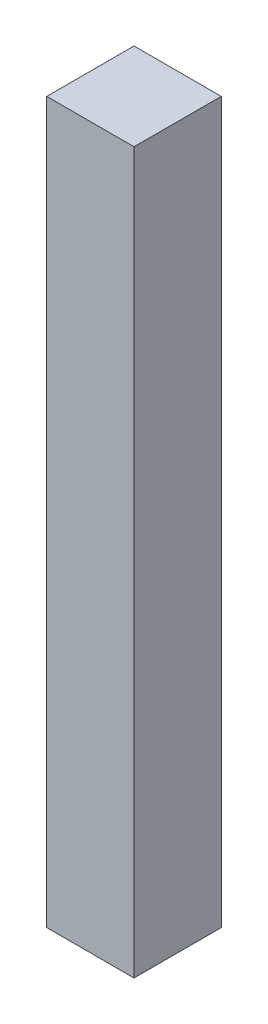
ISO-10303-21;
HEADER;
FILE_DESCRIPTION(('STEP AP214'),'2;1');
FILE_NAME('part.step','',(''),(''),'','','');
FILE_SCHEMA(('AUTOMOTIVE_DESIGN { 1 0 10303 214 1 1 1 1 }'));
ENDSEC;
DATA;
#1=APPLICATION_CONTEXT('core data for automotive mechanical design processes');
#2=APPLICATION_PROTOCOL_DEFINITION('international standard','automotive_design',2000,#1);
#3=PRODUCT_CONTEXT('',#1,'mechanical');
#4=PRODUCT('Part','Part','',(#3));
#5=PRODUCT_RELATED_PRODUCT_CATEGORY('part','',(#4));
#6=PRODUCT_DEFINITION_FORMATION('','',#4);
#7=PRODUCT_DEFINITION_CONTEXT('part definition',#1,'design');
#8=PRODUCT_DEFINITION('design','',#6,#7);
#9=PRODUCT_DEFINITION_SHAPE('','',#8);
#10=(LENGTH_UNIT() NAMED_UNIT(*) SI_UNIT(.MILLI.,.METRE.));
#11=(NAMED_UNIT(*) PLANE_ANGLE_UNIT() SI_UNIT($,.RADIAN.));
#12=(NAMED_UNIT(*) SI_UNIT($,.STERADIAN.) SOLID_ANGLE_UNIT());
#13=UNCERTAINTY_MEASURE_WITH_UNIT(LENGTH_MEASURE(1.E-05),#10,'distance_accuracy_value','');
#14=(GEOMETRIC_REPRESENTATION_CONTEXT(3) GLOBAL_UNCERTAINTY_ASSIGNED_CONTEXT((#13)) GLOBAL_UNIT_ASSIGNED_CONTEXT((#10,
#11,#12)) REPRESENTATION_CONTEXT('',''));
#15=CARTESIAN_POINT('',(0.,0.,0.));
#16=DIRECTION('',(0.,0.,1.));
#17=DIRECTION('',(1.,0.,0.));
#18=AXIS2_PLACEMENT_3D('',#15,#16,#17);
#19=CARTESIAN_POINT('',(-20.,330.,-20.));
#20=DIRECTION('',(1.,0.,0.));
#21=DIRECTION('',(0.,0.,-1.));
#22=AXIS2_PLACEMENT_3D('',#19,#20,#21);
#23=PLANE('',#22);
#24=DIRECTION('',(0.,0.,1.));
#25=VECTOR('',#24,1.);
#26=CARTESIAN_POINT('',(-20.,0.,-20.));
#27=LINE('',#26,#25);
#28=CARTESIAN_POINT('',(-20.,0.,-20.));
#29=VERTEX_POINT('',#28);
#30=CARTESIAN_POINT('',(-20.,0.,20.));
#31=VERTEX_POINT('',#30);
#32=EDGE_CURVE('E97',#29,#31,#27,.T.);
#33=ORIENTED_EDGE('',*,*,#32,.T.);
#34=DIRECTION('',(0.,-1.,0.));
#35=VECTOR('',#34,1.);
#36=CARTESIAN_POINT('',(-20.,330.,20.));
#37=LINE('',#36,#35);
#38=CARTESIAN_POINT('',(-20.,330.,20.));
#39=VERTEX_POINT('',#38);
#40=EDGE_CURVE('E11',#39,#31,#37,.T.);
#41=ORIENTED_EDGE('',*,*,#40,.F.);
#42=DIRECTION('',(0.,0.,1.));
#43=VECTOR('',#42,1.);
#44=CARTESIAN_POINT('',(-20.,330.,-20.));
#45=LINE('',#44,#43);
#46=CARTESIAN_POINT('',(-20.,330.,-20.));
#47=VERTEX_POINT('',#46);
#48=EDGE_CURVE('E85',#47,#39,#45,.T.);
#49=ORIENTED_EDGE('',*,*,#48,.F.);
#50=DIRECTION('',(0.,-1.,0.));
#51=VECTOR('',#50,1.);
#52=CARTESIAN_POINT('',(-20.,330.,-20.));
#53=LINE('',#52,#51);
#54=EDGE_CURVE('E93',#47,#29,#53,.T.);
#55=ORIENTED_EDGE('',*,*,#54,.T.);
#56=EDGE_LOOP('',(#33,#41,#49,#55));
#57=FACE_BOUND('',#56,.T.);
#58=ADVANCED_FACE('F34',(#57),#23,.F.);
#59=CARTESIAN_POINT('',(-20.,330.,20.));
#60=DIRECTION('',(0.,0.,-1.));
#61=DIRECTION('',(-1.,0.,0.));
#62=AXIS2_PLACEMENT_3D('',#59,#60,#61);
#63=PLANE('',#62);
#64=DIRECTION('',(1.,0.,0.));
#65=VECTOR('',#64,1.);
#66=CARTESIAN_POINT('',(-20.,0.,20.));
#67=LINE('',#66,#65);
#68=CARTESIAN_POINT('',(20.,0.,20.));
#69=VERTEX_POINT('',#68);
#70=EDGE_CURVE('E89',#31,#69,#67,.T.);
#71=ORIENTED_EDGE('',*,*,#70,.T.);
#72=DIRECTION('',(0.,-1.,0.));
#73=VECTOR('',#72,1.);
#74=CARTESIAN_POINT('',(20.,330.,20.));
#75=LINE('',#74,#73);
#76=CARTESIAN_POINT('',(20.,330.,20.));
#77=VERTEX_POINT('',#76);
#78=EDGE_CURVE('E42',#77,#69,#75,.T.);
#79=ORIENTED_EDGE('',*,*,#78,.F.);
#80=DIRECTION('',(1.,0.,0.));
#81=VECTOR('',#80,1.);
#82=CARTESIAN_POINT('',(-20.,330.,20.));
#83=LINE('',#82,#81);
#84=EDGE_CURVE('E80',#39,#77,#83,.T.);
#85=ORIENTED_EDGE('',*,*,#84,.F.);
#86=ORIENTED_EDGE('',*,*,#40,.T.);
#87=EDGE_LOOP('',(#71,#79,#85,#86));
#88=FACE_BOUND('',#87,.T.);
#89=ADVANCED_FACE('F88',(#88),#63,.F.);
#90=CARTESIAN_POINT('',(20.,330.,-20.));
#91=DIRECTION('',(-1.,0.,0.));
#92=DIRECTION('',(0.,0.,1.));
#93=AXIS2_PLACEMENT_3D('',#90,#91,#92);
#94=PLANE('',#93);
#95=DIRECTION('',(0.,0.,-1.));
#96=VECTOR('',#95,1.);
#97=CARTESIAN_POINT('',(20.,0.,-20.));
#98=LINE('',#97,#96);
#99=CARTESIAN_POINT('',(20.,0.,-20.));
#100=VERTEX_POINT('',#99);
#101=EDGE_CURVE('E67',#69,#100,#98,.T.);
#102=ORIENTED_EDGE('',*,*,#101,.T.);
#103=DIRECTION('',(0.,-1.,0.));
#104=VECTOR('',#103,1.);
#105=CARTESIAN_POINT('',(20.,330.,-20.));
#106=LINE('',#105,#104);
#107=CARTESIAN_POINT('',(20.,330.,-20.));
#108=VERTEX_POINT('',#107);
#109=EDGE_CURVE('E90',#108,#100,#106,.T.);
#110=ORIENTED_EDGE('',*,*,#109,.F.);
#111=DIRECTION('',(0.,0.,-1.));
#112=VECTOR('',#111,1.);
#113=CARTESIAN_POINT('',(20.,330.,-20.));
#114=LINE('',#113,#112);
#115=EDGE_CURVE('E83',#77,#108,#114,.T.);
#116=ORIENTED_EDGE('',*,*,#115,.F.);
#117=ORIENTED_EDGE('',*,*,#78,.T.);
#118=EDGE_LOOP('',(#102,#110,#116,#117));
#119=FACE_BOUND('',#118,.T.);
#120=ADVANCED_FACE('F91',(#119),#94,.F.);
#121=CARTESIAN_POINT('',(-20.,330.,-20.));
#122=DIRECTION('',(0.,0.,1.));
#123=DIRECTION('',(1.,0.,0.));
#124=AXIS2_PLACEMENT_3D('',#121,#122,#123);
#125=PLANE('',#124);
#126=DIRECTION('',(-1.,0.,0.));
#127=VECTOR('',#126,1.);
#128=CARTESIAN_POINT('',(-20.,0.,-20.));
#129=LINE('',#128,#127);
#130=EDGE_CURVE('E73',#100,#29,#129,.T.);
#131=ORIENTED_EDGE('',*,*,#130,.T.);
#132=ORIENTED_EDGE('',*,*,#54,.F.);
#133=DIRECTION('',(-1.,0.,0.));
#134=VECTOR('',#133,1.);
#135=CARTESIAN_POINT('',(-20.,330.,-20.));
#136=LINE('',#135,#134);
#137=EDGE_CURVE('E50',#108,#47,#136,.T.);
#138=ORIENTED_EDGE('',*,*,#137,.F.);
#139=ORIENTED_EDGE('',*,*,#109,.T.);
#140=EDGE_LOOP('',(#131,#132,#138,#139));
#141=FACE_BOUND('',#140,.T.);
#142=ADVANCED_FACE('F104',(#141),#125,.F.);
#143=CARTESIAN_POINT('',(0.,330.,0.));
#144=DIRECTION('',(0.,1.,0.));
#145=DIRECTION('',(0.,0.,1.));
#146=AXIS2_PLACEMENT_3D('',#143,#144,#145);
#147=PLANE('',#146);
#148=ORIENTED_EDGE('',*,*,#48,.T.);
#149=ORIENTED_EDGE('',*,*,#84,.T.);
#150=ORIENTED_EDGE('',*,*,#115,.T.);
#151=ORIENTED_EDGE('',*,*,#137,.T.);
#152=EDGE_LOOP('',(#148,#149,#150,#151));
#153=FACE_BOUND('',#152,.T.);
#154=ADVANCED_FACE('F81',(#153),#147,.T.);
#155=CARTESIAN_POINT('',(0.,0.,0.));
#156=DIRECTION('',(0.,1.,0.));
#157=DIRECTION('',(0.,0.,1.));
#158=AXIS2_PLACEMENT_3D('',#155,#156,#157);
#159=PLANE('',#158);
#160=ORIENTED_EDGE('',*,*,#32,.F.);
#161=ORIENTED_EDGE('',*,*,#130,.F.);
#162=ORIENTED_EDGE('',*,*,#101,.F.);
#163=ORIENTED_EDGE('',*,*,#70,.F.);
#164=EDGE_LOOP('',(#160,#161,#162,#163));
#165=FACE_BOUND('',#164,.T.);
#166=ADVANCED_FACE('F107',(#165),#159,.F.);
#167=CLOSED_SHELL('',(#58,#89,#120,#142,#154,#166));
#168=MANIFOLD_SOLID_BREP('B2',#167);
#169=ADVANCED_BREP_SHAPE_REPRESENTATION('',(#18,#168),#14);
#170=SHAPE_DEFINITION_REPRESENTATION(#9,#169);
ENDSEC;
END-ISO-10303-21;
